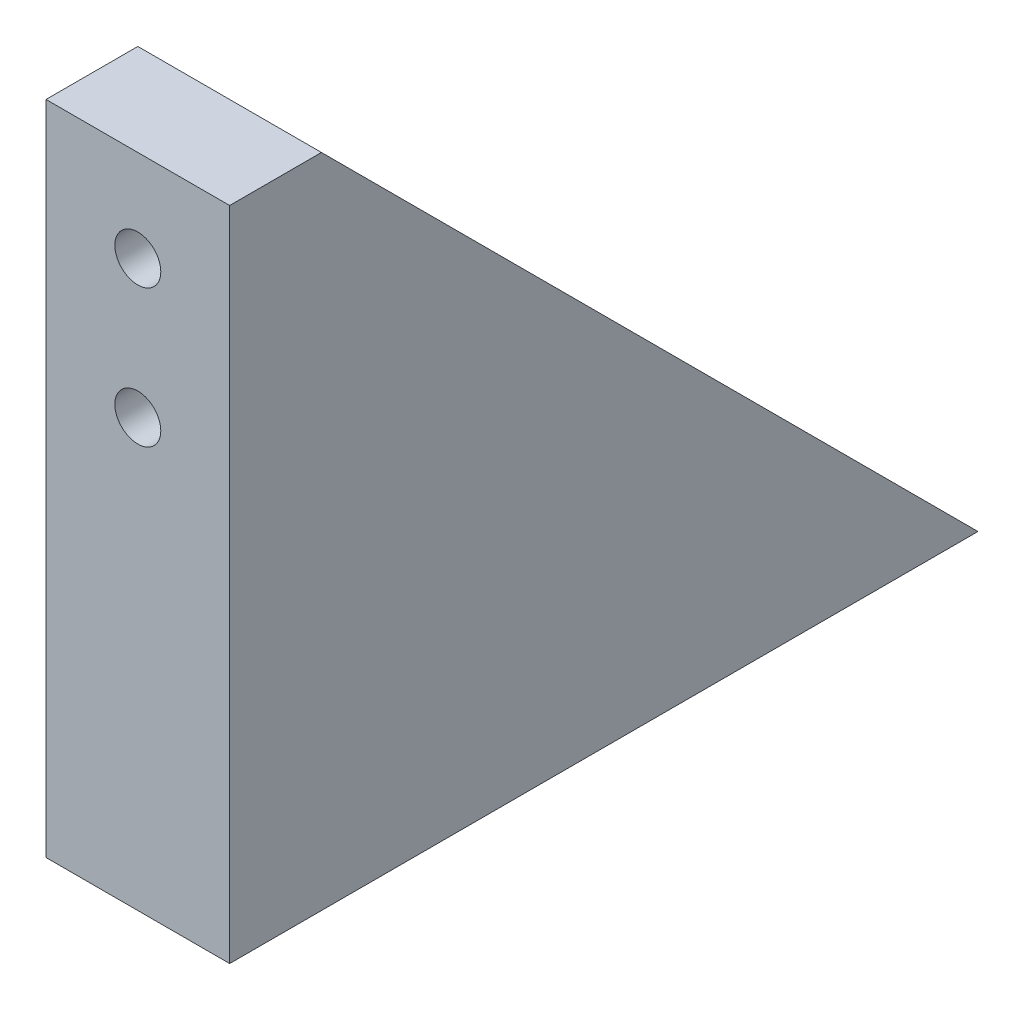
ISO-10303-21;
HEADER;
FILE_DESCRIPTION(('STEP AP214'),'2;1');
FILE_NAME('part.step','',(''),(''),'','','');
FILE_SCHEMA(('AUTOMOTIVE_DESIGN { 1 0 10303 214 1 1 1 1 }'));
ENDSEC;
DATA;
#1=APPLICATION_CONTEXT('core data for automotive mechanical design processes');
#2=APPLICATION_PROTOCOL_DEFINITION('international standard','automotive_design',2000,#1);
#3=PRODUCT_CONTEXT('',#1,'mechanical');
#4=PRODUCT('Part','Part','',(#3));
#5=PRODUCT_RELATED_PRODUCT_CATEGORY('part','',(#4));
#6=PRODUCT_DEFINITION_FORMATION('','',#4);
#7=PRODUCT_DEFINITION_CONTEXT('part definition',#1,'design');
#8=PRODUCT_DEFINITION('design','',#6,#7);
#9=PRODUCT_DEFINITION_SHAPE('','',#8);
#10=(LENGTH_UNIT() NAMED_UNIT(*) SI_UNIT(.MILLI.,.METRE.));
#11=(NAMED_UNIT(*) PLANE_ANGLE_UNIT() SI_UNIT($,.RADIAN.));
#12=(NAMED_UNIT(*) SI_UNIT($,.STERADIAN.) SOLID_ANGLE_UNIT());
#13=UNCERTAINTY_MEASURE_WITH_UNIT(LENGTH_MEASURE(1.E-05),#10,'distance_accuracy_value','');
#14=(GEOMETRIC_REPRESENTATION_CONTEXT(3) GLOBAL_UNCERTAINTY_ASSIGNED_CONTEXT((#13)) GLOBAL_UNIT_ASSIGNED_CONTEXT((#10,
#11,#12)) REPRESENTATION_CONTEXT('',''));
#15=CARTESIAN_POINT('',(0.,0.,0.));
#16=DIRECTION('',(0.,0.,1.));
#17=DIRECTION('',(1.,0.,0.));
#18=AXIS2_PLACEMENT_3D('',#15,#16,#17);
#19=CARTESIAN_POINT('',(0.,0.,5.));
#20=DIRECTION('',(0.,0.,-1.));
#21=DIRECTION('',(-1.,0.,0.));
#22=AXIS2_PLACEMENT_3D('',#19,#20,#21);
#23=PLANE('',#22);
#24=DIRECTION('',(0.,1.,0.));
#25=VECTOR('',#24,1.);
#26=CARTESIAN_POINT('',(9.99999999999999,-35.75,5.));
#27=LINE('',#26,#25);
#28=CARTESIAN_POINT('',(9.99999999999999,-35.75,5.));
#29=VERTEX_POINT('',#28);
#30=CARTESIAN_POINT('',(9.99999999999999,35.75,5.));
#31=VERTEX_POINT('',#30);
#32=EDGE_CURVE('E105',#29,#31,#27,.T.);
#33=ORIENTED_EDGE('',*,*,#32,.T.);
#34=DIRECTION('',(-1.,0.,0.));
#35=VECTOR('',#34,1.);
#36=CARTESIAN_POINT('',(-10.,35.75,5.));
#37=LINE('',#36,#35);
#38=CARTESIAN_POINT('',(-10.,35.75,5.));
#39=VERTEX_POINT('',#38);
#40=EDGE_CURVE('E121',#31,#39,#37,.T.);
#41=ORIENTED_EDGE('',*,*,#40,.T.);
#42=DIRECTION('',(0.,-1.,0.));
#43=VECTOR('',#42,1.);
#44=CARTESIAN_POINT('',(-10.,-35.75,5.));
#45=LINE('',#44,#43);
#46=CARTESIAN_POINT('',(-10.,-35.75,5.));
#47=VERTEX_POINT('',#46);
#48=EDGE_CURVE('E109',#39,#47,#45,.T.);
#49=ORIENTED_EDGE('',*,*,#48,.T.);
#50=DIRECTION('',(1.,0.,0.));
#51=VECTOR('',#50,1.);
#52=CARTESIAN_POINT('',(-10.,-35.75,5.));
#53=LINE('',#52,#51);
#54=EDGE_CURVE('E61',#47,#29,#53,.T.);
#55=ORIENTED_EDGE('',*,*,#54,.T.);
#56=EDGE_LOOP('',(#33,#41,#49,#55));
#57=FACE_BOUND('',#56,.T.);
#58=CARTESIAN_POINT('',(0.,25.75,5.));
#59=DIRECTION('',(0.,0.,1.));
#60=DIRECTION('',(1.,0.,0.));
#61=AXIS2_PLACEMENT_3D('',#58,#59,#60);
#62=CIRCLE('',#61,2.5);
#63=CARTESIAN_POINT('',(2.49999999999999,25.75,5.));
#64=VERTEX_POINT('',#63);
#65=EDGE_CURVE('E106',#64,#64,#62,.T.);
#66=ORIENTED_EDGE('',*,*,#65,.F.);
#67=EDGE_LOOP('',(#66));
#68=FACE_BOUND('',#67,.T.);
#69=CARTESIAN_POINT('',(0.,10.75,5.));
#70=DIRECTION('',(0.,0.,1.));
#71=DIRECTION('',(1.,0.,0.));
#72=AXIS2_PLACEMENT_3D('',#69,#70,#71);
#73=CIRCLE('',#72,2.5);
#74=CARTESIAN_POINT('',(2.5,10.75,5.));
#75=VERTEX_POINT('',#74);
#76=EDGE_CURVE('E135',#75,#75,#73,.T.);
#77=ORIENTED_EDGE('',*,*,#76,.F.);
#78=EDGE_LOOP('',(#77));
#79=FACE_BOUND('',#78,.T.);
#80=ADVANCED_FACE('F44',(#57,#68,#79),#23,.F.);
#81=CARTESIAN_POINT('',(9.99999999999999,-35.75,5.));
#82=DIRECTION('',(-1.,0.,0.));
#83=DIRECTION('',(0.,0.,1.));
#84=AXIS2_PLACEMENT_3D('',#81,#82,#83);
#85=PLANE('',#84);
#86=DIRECTION('',(0.,0.,-1.));
#87=VECTOR('',#86,1.);
#88=CARTESIAN_POINT('',(9.99999999999999,-35.75,5.));
#89=LINE('',#88,#87);
#90=CARTESIAN_POINT('',(9.99999999999999,-35.75,-76.4999999999993));
#91=VERTEX_POINT('',#90);
#92=EDGE_CURVE('E112',#29,#91,#89,.T.);
#93=ORIENTED_EDGE('',*,*,#92,.T.);
#94=DIRECTION('',(0.,0.707106781186551,0.707106781186544));
#95=VECTOR('',#94,1.);
#96=CARTESIAN_POINT('',(9.99999999999999,-35.75,-76.4999999999993));
#97=LINE('',#96,#95);
#98=CARTESIAN_POINT('',(9.99999999999999,35.75,-5.));
#99=VERTEX_POINT('',#98);
#100=EDGE_CURVE('E97',#91,#99,#97,.T.);
#101=ORIENTED_EDGE('',*,*,#100,.T.);
#102=DIRECTION('',(0.,0.,-1.));
#103=VECTOR('',#102,1.);
#104=CARTESIAN_POINT('',(9.99999999999999,35.75,5.));
#105=LINE('',#104,#103);
#106=EDGE_CURVE('E11',#31,#99,#105,.T.);
#107=ORIENTED_EDGE('',*,*,#106,.F.);
#108=ORIENTED_EDGE('',*,*,#32,.F.);
#109=EDGE_LOOP('',(#93,#101,#107,#108));
#110=FACE_BOUND('',#109,.T.);
#111=ADVANCED_FACE('F46',(#110),#85,.F.);
#112=CARTESIAN_POINT('',(-10.,35.75,5.));
#113=DIRECTION('',(0.,-1.,0.));
#114=DIRECTION('',(0.,0.,-1.));
#115=AXIS2_PLACEMENT_3D('',#112,#113,#114);
#116=PLANE('',#115);
#117=DIRECTION('',(-1.,0.,0.));
#118=VECTOR('',#117,1.);
#119=CARTESIAN_POINT('',(-10.,35.75,-5.));
#120=LINE('',#119,#118);
#121=CARTESIAN_POINT('',(-10.,35.75,-5.));
#122=VERTEX_POINT('',#121);
#123=EDGE_CURVE('E91',#99,#122,#120,.T.);
#124=ORIENTED_EDGE('',*,*,#123,.T.);
#125=DIRECTION('',(0.,0.,-1.));
#126=VECTOR('',#125,1.);
#127=CARTESIAN_POINT('',(-10.,35.75,5.));
#128=LINE('',#127,#126);
#129=EDGE_CURVE('E54',#39,#122,#128,.T.);
#130=ORIENTED_EDGE('',*,*,#129,.F.);
#131=ORIENTED_EDGE('',*,*,#40,.F.);
#132=ORIENTED_EDGE('',*,*,#106,.T.);
#133=EDGE_LOOP('',(#124,#130,#131,#132));
#134=FACE_BOUND('',#133,.T.);
#135=ADVANCED_FACE('F101',(#134),#116,.F.);
#136=CARTESIAN_POINT('',(-10.,-35.75,5.));
#137=DIRECTION('',(1.,0.,0.));
#138=DIRECTION('',(0.,0.,-1.));
#139=AXIS2_PLACEMENT_3D('',#136,#137,#138);
#140=PLANE('',#139);
#141=ORIENTED_EDGE('',*,*,#129,.T.);
#142=DIRECTION('',(0.,0.707106781186551,0.707106781186544));
#143=VECTOR('',#142,1.);
#144=CARTESIAN_POINT('',(-10.,-35.75,-76.4999999999993));
#145=LINE('',#144,#143);
#146=CARTESIAN_POINT('',(-10.,-35.75,-76.4999999999993));
#147=VERTEX_POINT('',#146);
#148=EDGE_CURVE('E87',#147,#122,#145,.T.);
#149=ORIENTED_EDGE('',*,*,#148,.F.);
#150=DIRECTION('',(0.,0.,-1.));
#151=VECTOR('',#150,1.);
#152=CARTESIAN_POINT('',(-10.,-35.75,5.));
#153=LINE('',#152,#151);
#154=EDGE_CURVE('E82',#47,#147,#153,.T.);
#155=ORIENTED_EDGE('',*,*,#154,.F.);
#156=ORIENTED_EDGE('',*,*,#48,.F.);
#157=EDGE_LOOP('',(#141,#149,#155,#156));
#158=FACE_BOUND('',#157,.T.);
#159=ADVANCED_FACE('F108',(#158),#140,.F.);
#160=CARTESIAN_POINT('',(-10.,-35.75,5.));
#161=DIRECTION('',(0.,1.,0.));
#162=DIRECTION('',(0.,0.,1.));
#163=AXIS2_PLACEMENT_3D('',#160,#161,#162);
#164=PLANE('',#163);
#165=CARTESIAN_POINT('',(0.,-35.75,-5.));
#166=DIRECTION('',(0.,-1.,0.));
#167=DIRECTION('',(0.,0.,-1.));
#168=AXIS2_PLACEMENT_3D('',#165,#166,#167);
#169=CIRCLE('',#168,1.5);
#170=CARTESIAN_POINT('',(0.,-35.75,-6.5));
#171=VERTEX_POINT('',#170);
#172=EDGE_CURVE('E170',#171,#171,#169,.T.);
#173=ORIENTED_EDGE('',*,*,#172,.F.);
#174=EDGE_LOOP('',(#173));
#175=FACE_BOUND('',#174,.T.);
#176=CARTESIAN_POINT('',(0.,-35.75,-45.));
#177=DIRECTION('',(0.,-1.,0.));
#178=DIRECTION('',(0.,0.,-1.));
#179=AXIS2_PLACEMENT_3D('',#176,#177,#178);
#180=CIRCLE('',#179,1.5);
#181=CARTESIAN_POINT('',(0.,-35.75,-46.5));
#182=VERTEX_POINT('',#181);
#183=EDGE_CURVE('E166',#182,#182,#180,.T.);
#184=ORIENTED_EDGE('',*,*,#183,.F.);
#185=EDGE_LOOP('',(#184));
#186=FACE_BOUND('',#185,.T.);
#187=ORIENTED_EDGE('',*,*,#154,.T.);
#188=DIRECTION('',(1.,0.,0.));
#189=VECTOR('',#188,1.);
#190=CARTESIAN_POINT('',(-10.,-35.75,-76.4999999999993));
#191=LINE('',#190,#189);
#192=EDGE_CURVE('E93',#147,#91,#191,.T.);
#193=ORIENTED_EDGE('',*,*,#192,.T.);
#194=ORIENTED_EDGE('',*,*,#92,.F.);
#195=ORIENTED_EDGE('',*,*,#54,.F.);
#196=EDGE_LOOP('',(#187,#193,#194,#195));
#197=FACE_BOUND('',#196,.T.);
#198=ADVANCED_FACE('F187',(#175,#186,#197),#164,.F.);
#199=CARTESIAN_POINT('',(0.,25.75,5.));
#200=DIRECTION('',(0.,0.,-1.));
#201=DIRECTION('',(-1.,0.,0.));
#202=AXIS2_PLACEMENT_3D('',#199,#200,#201);
#203=CYLINDRICAL_SURFACE('',#202,2.5);
#204=ORIENTED_EDGE('',*,*,#65,.T.);
#205=EDGE_LOOP('',(#204));
#206=FACE_BOUND('',#205,.T.);
#207=CARTESIAN_POINT('',(0.,25.75,-5.));
#208=DIRECTION('',(0.,0.,1.));
#209=DIRECTION('',(1.,0.,0.));
#210=AXIS2_PLACEMENT_3D('',#207,#208,#209);
#211=CIRCLE('',#210,2.5);
#212=CARTESIAN_POINT('',(2.49999999999999,25.75,-5.));
#213=VERTEX_POINT('',#212);
#214=EDGE_CURVE('E126',#213,#213,#211,.T.);
#215=ORIENTED_EDGE('',*,*,#214,.F.);
#216=EDGE_LOOP('',(#215));
#217=FACE_BOUND('',#216,.T.);
#218=ADVANCED_FACE('F190',(#206,#217),#203,.F.);
#219=CARTESIAN_POINT('',(0.,10.75,5.));
#220=DIRECTION('',(0.,0.,-1.));
#221=DIRECTION('',(-1.,0.,0.));
#222=AXIS2_PLACEMENT_3D('',#219,#220,#221);
#223=CYLINDRICAL_SURFACE('',#222,2.5);
#224=ORIENTED_EDGE('',*,*,#76,.T.);
#225=EDGE_LOOP('',(#224));
#226=FACE_BOUND('',#225,.T.);
#227=CARTESIAN_POINT('',(0.,10.75,-5.));
#228=DIRECTION('',(0.,0.,1.));
#229=DIRECTION('',(1.,0.,0.));
#230=AXIS2_PLACEMENT_3D('',#227,#228,#229);
#231=CIRCLE('',#230,2.5);
#232=CARTESIAN_POINT('',(2.5,10.75,-5.));
#233=VERTEX_POINT('',#232);
#234=EDGE_CURVE('E130',#233,#233,#231,.T.);
#235=ORIENTED_EDGE('',*,*,#234,.F.);
#236=EDGE_LOOP('',(#235));
#237=FACE_BOUND('',#236,.T.);
#238=ADVANCED_FACE('F242',(#226,#237),#223,.F.);
#239=CARTESIAN_POINT('',(-10.,-35.75,-76.4999999999993));
#240=DIRECTION('',(0.,0.707106781186544,-0.707106781186551));
#241=DIRECTION('',(0.,0.707106781186551,0.707106781186544));
#242=AXIS2_PLACEMENT_3D('',#239,#240,#241);
#243=PLANE('',#242);
#244=CARTESIAN_POINT('',(0.,25.75,-14.9999999999999));
#245=DIRECTION('',(0.,0.707106781186544,-0.707106781186551));
#246=DIRECTION('',(0.,0.707106781186551,0.707106781186544));
#247=AXIS2_PLACEMENT_3D('',#244,#245,#246);
#248=ELLIPSE('',#247,4.94974746830581,3.5);
#249=CARTESIAN_POINT('',(0.,29.25,-11.4999999999999));
#250=VERTEX_POINT('',#249);
#251=EDGE_CURVE('E155',#250,#250,#248,.F.);
#252=ORIENTED_EDGE('',*,*,#251,.T.);
#253=EDGE_LOOP('',(#252));
#254=FACE_BOUND('',#253,.T.);
#255=CARTESIAN_POINT('',(0.,10.75,-29.9999999999997));
#256=DIRECTION('',(0.,0.707106781186544,-0.707106781186551));
#257=DIRECTION('',(0.,0.707106781186551,0.707106781186544));
#258=AXIS2_PLACEMENT_3D('',#255,#256,#257);
#259=ELLIPSE('',#258,4.94974746830581,3.5);
#260=CARTESIAN_POINT('',(0.,14.25,-26.4999999999998));
#261=VERTEX_POINT('',#260);
#262=EDGE_CURVE('E150',#261,#261,#259,.F.);
#263=ORIENTED_EDGE('',*,*,#262,.T.);
#264=EDGE_LOOP('',(#263));
#265=FACE_BOUND('',#264,.T.);
#266=ORIENTED_EDGE('',*,*,#100,.F.);
#267=ORIENTED_EDGE('',*,*,#192,.F.);
#268=ORIENTED_EDGE('',*,*,#148,.T.);
#269=ORIENTED_EDGE('',*,*,#123,.F.);
#270=EDGE_LOOP('',(#266,#267,#268,#269));
#271=FACE_BOUND('',#270,.T.);
#272=ADVANCED_FACE('F90',(#254,#265,#271),#243,.T.);
#273=CARTESIAN_POINT('',(0.,10.75,-76.5009999999993));
#274=DIRECTION('',(0.,0.,1.));
#275=DIRECTION('',(1.,0.,0.));
#276=AXIS2_PLACEMENT_3D('',#273,#274,#275);
#277=CYLINDRICAL_SURFACE('',#276,3.5);
#278=ORIENTED_EDGE('',*,*,#262,.F.);
#279=EDGE_LOOP('',(#278));
#280=FACE_BOUND('',#279,.T.);
#281=CARTESIAN_POINT('',(0.,10.75,-5.));
#282=DIRECTION('',(0.,0.,1.));
#283=DIRECTION('',(1.,0.,0.));
#284=AXIS2_PLACEMENT_3D('',#281,#282,#283);
#285=CIRCLE('',#284,3.5);
#286=CARTESIAN_POINT('',(3.49999999999999,10.75,-5.));
#287=VERTEX_POINT('',#286);
#288=EDGE_CURVE('E146',#287,#287,#285,.T.);
#289=ORIENTED_EDGE('',*,*,#288,.T.);
#290=EDGE_LOOP('',(#289));
#291=FACE_BOUND('',#290,.T.);
#292=ADVANCED_FACE('F241',(#280,#291),#277,.F.);
#293=CARTESIAN_POINT('',(0.,10.75,-5.));
#294=DIRECTION('',(0.,0.,1.));
#295=DIRECTION('',(1.,0.,0.));
#296=AXIS2_PLACEMENT_3D('',#293,#294,#295);
#297=PLANE('',#296);
#298=ORIENTED_EDGE('',*,*,#234,.T.);
#299=EDGE_LOOP('',(#298));
#300=FACE_BOUND('',#299,.T.);
#301=ORIENTED_EDGE('',*,*,#288,.F.);
#302=EDGE_LOOP('',(#301));
#303=FACE_BOUND('',#302,.T.);
#304=ADVANCED_FACE('F251',(#300,#303),#297,.F.);
#305=CARTESIAN_POINT('',(0.,25.75,-76.5009999999993));
#306=DIRECTION('',(0.,0.,1.));
#307=DIRECTION('',(1.,0.,0.));
#308=AXIS2_PLACEMENT_3D('',#305,#306,#307);
#309=CYLINDRICAL_SURFACE('',#308,3.5);
#310=ORIENTED_EDGE('',*,*,#251,.F.);
#311=EDGE_LOOP('',(#310));
#312=FACE_BOUND('',#311,.T.);
#313=CARTESIAN_POINT('',(0.,25.75,-5.));
#314=DIRECTION('',(0.,0.,1.));
#315=DIRECTION('',(1.,0.,0.));
#316=AXIS2_PLACEMENT_3D('',#313,#314,#315);
#317=CIRCLE('',#316,3.5);
#318=CARTESIAN_POINT('',(3.49999999999999,25.75,-5.));
#319=VERTEX_POINT('',#318);
#320=EDGE_CURVE('E131',#319,#319,#317,.T.);
#321=ORIENTED_EDGE('',*,*,#320,.T.);
#322=EDGE_LOOP('',(#321));
#323=FACE_BOUND('',#322,.T.);
#324=ADVANCED_FACE('F205',(#312,#323),#309,.F.);
#325=CARTESIAN_POINT('',(0.,25.75,-5.));
#326=DIRECTION('',(0.,0.,1.));
#327=DIRECTION('',(1.,0.,0.));
#328=AXIS2_PLACEMENT_3D('',#325,#326,#327);
#329=PLANE('',#328);
#330=ORIENTED_EDGE('',*,*,#214,.T.);
#331=EDGE_LOOP('',(#330));
#332=FACE_BOUND('',#331,.T.);
#333=ORIENTED_EDGE('',*,*,#320,.F.);
#334=EDGE_LOOP('',(#333));
#335=FACE_BOUND('',#334,.T.);
#336=ADVANCED_FACE('F196',(#332,#335),#329,.F.);
#337=CARTESIAN_POINT('',(0.,-25.75,-45.));
#338=DIRECTION('',(0.,-1.,0.));
#339=DIRECTION('',(0.,0.,-1.));
#340=AXIS2_PLACEMENT_3D('',#337,#338,#339);
#341=CYLINDRICAL_SURFACE('',#340,1.5);
#342=CARTESIAN_POINT('',(0.,-25.75,-45.));
#343=DIRECTION('',(0.,-1.,0.));
#344=DIRECTION('',(0.,0.,-1.));
#345=AXIS2_PLACEMENT_3D('',#342,#343,#344);
#346=CIRCLE('',#345,1.5);
#347=CARTESIAN_POINT('',(0.,-25.75,-46.5));
#348=VERTEX_POINT('',#347);
#349=EDGE_CURVE('E162',#348,#348,#346,.T.);
#350=ORIENTED_EDGE('',*,*,#349,.F.);
#351=EDGE_LOOP('',(#350));
#352=FACE_BOUND('',#351,.T.);
#353=ORIENTED_EDGE('',*,*,#183,.T.);
#354=EDGE_LOOP('',(#353));
#355=FACE_BOUND('',#354,.T.);
#356=ADVANCED_FACE('F194',(#352,#355),#341,.F.);
#357=CARTESIAN_POINT('',(0.,-25.75,-45.));
#358=DIRECTION('',(0.,-1.,0.));
#359=DIRECTION('',(0.,0.,-1.));
#360=AXIS2_PLACEMENT_3D('',#357,#358,#359);
#361=PLANE('',#360);
#362=ORIENTED_EDGE('',*,*,#349,.T.);
#363=EDGE_LOOP('',(#362));
#364=FACE_BOUND('',#363,.T.);
#365=ADVANCED_FACE('F183',(#364),#361,.T.);
#366=CARTESIAN_POINT('',(0.,-25.75,-5.));
#367=DIRECTION('',(0.,-1.,0.));
#368=DIRECTION('',(0.,0.,-1.));
#369=AXIS2_PLACEMENT_3D('',#366,#367,#368);
#370=CYLINDRICAL_SURFACE('',#369,1.5);
#371=CARTESIAN_POINT('',(0.,-25.75,-5.));
#372=DIRECTION('',(0.,-1.,0.));
#373=DIRECTION('',(0.,0.,-1.));
#374=AXIS2_PLACEMENT_3D('',#371,#372,#373);
#375=CIRCLE('',#374,1.5);
#376=CARTESIAN_POINT('',(0.,-25.75,-6.5));
#377=VERTEX_POINT('',#376);
#378=EDGE_CURVE('E151',#377,#377,#375,.T.);
#379=ORIENTED_EDGE('',*,*,#378,.F.);
#380=EDGE_LOOP('',(#379));
#381=FACE_BOUND('',#380,.T.);
#382=ORIENTED_EDGE('',*,*,#172,.T.);
#383=EDGE_LOOP('',(#382));
#384=FACE_BOUND('',#383,.T.);
#385=ADVANCED_FACE('F180',(#381,#384),#370,.F.);
#386=CARTESIAN_POINT('',(0.,-25.75,-5.));
#387=DIRECTION('',(0.,-1.,0.));
#388=DIRECTION('',(0.,0.,-1.));
#389=AXIS2_PLACEMENT_3D('',#386,#387,#388);
#390=PLANE('',#389);
#391=ORIENTED_EDGE('',*,*,#378,.T.);
#392=EDGE_LOOP('',(#391));
#393=FACE_BOUND('',#392,.T.);
#394=ADVANCED_FACE('F178',(#393),#390,.T.);
#395=CLOSED_SHELL('',(#80,#111,#135,#159,#198,#218,#238,#272,#292,#304,#324,#336,#356,#365,#385,#394));
#396=MANIFOLD_SOLID_BREP('B2',#395);
#397=ADVANCED_BREP_SHAPE_REPRESENTATION('',(#18,#396),#14);
#398=SHAPE_DEFINITION_REPRESENTATION(#9,#397);
ENDSEC;
END-ISO-10303-21;
